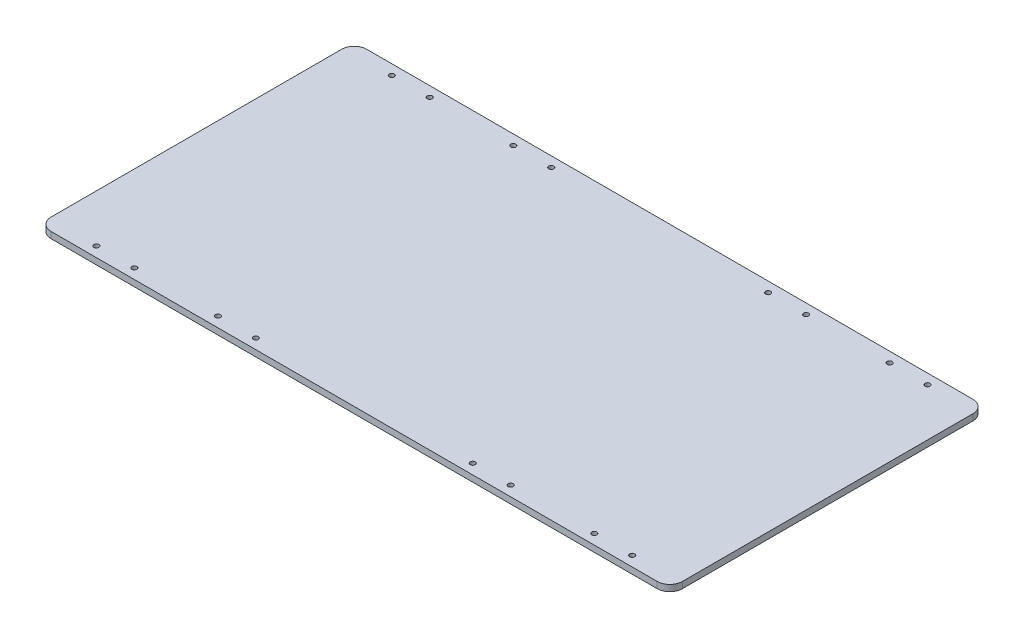
ISO-10303-21;
HEADER;
FILE_DESCRIPTION(('STEP AP214'),'2;1');
FILE_NAME('part.step','',(''),(''),'','','');
FILE_SCHEMA(('AUTOMOTIVE_DESIGN { 1 0 10303 214 1 1 1 1 }'));
ENDSEC;
DATA;
#1=APPLICATION_CONTEXT('core data for automotive mechanical design processes');
#2=APPLICATION_PROTOCOL_DEFINITION('international standard','automotive_design',2000,#1);
#3=PRODUCT_CONTEXT('',#1,'mechanical');
#4=PRODUCT('Part','Part','',(#3));
#5=PRODUCT_RELATED_PRODUCT_CATEGORY('part','',(#4));
#6=PRODUCT_DEFINITION_FORMATION('','',#4);
#7=PRODUCT_DEFINITION_CONTEXT('part definition',#1,'design');
#8=PRODUCT_DEFINITION('design','',#6,#7);
#9=PRODUCT_DEFINITION_SHAPE('','',#8);
#10=(LENGTH_UNIT() NAMED_UNIT(*) SI_UNIT(.MILLI.,.METRE.));
#11=(NAMED_UNIT(*) PLANE_ANGLE_UNIT() SI_UNIT($,.RADIAN.));
#12=(NAMED_UNIT(*) SI_UNIT($,.STERADIAN.) SOLID_ANGLE_UNIT());
#13=UNCERTAINTY_MEASURE_WITH_UNIT(LENGTH_MEASURE(1.E-05),#10,'distance_accuracy_value','');
#14=(GEOMETRIC_REPRESENTATION_CONTEXT(3) GLOBAL_UNCERTAINTY_ASSIGNED_CONTEXT((#13)) GLOBAL_UNIT_ASSIGNED_CONTEXT((#10,
#11,#12)) REPRESENTATION_CONTEXT('',''));
#15=CARTESIAN_POINT('',(0.,0.,0.));
#16=DIRECTION('',(0.,0.,1.));
#17=DIRECTION('',(1.,0.,0.));
#18=AXIS2_PLACEMENT_3D('',#15,#16,#17);
#19=CARTESIAN_POINT('',(240.,5.,-115.));
#20=DIRECTION('',(0.,-1.,0.));
#21=DIRECTION('',(0.,0.,-1.));
#22=AXIS2_PLACEMENT_3D('',#19,#20,#21);
#23=CYLINDRICAL_SURFACE('',#22,10.);
#24=CARTESIAN_POINT('',(240.,0.,-115.));
#25=DIRECTION('',(0.,1.,0.));
#26=DIRECTION('',(0.,0.,1.));
#27=AXIS2_PLACEMENT_3D('',#24,#25,#26);
#28=CIRCLE('',#27,10.);
#29=CARTESIAN_POINT('',(250.,0.,-115.));
#30=VERTEX_POINT('',#29);
#31=CARTESIAN_POINT('',(240.,0.,-125.));
#32=VERTEX_POINT('',#31);
#33=EDGE_CURVE('E147',#30,#32,#28,.T.);
#34=ORIENTED_EDGE('',*,*,#33,.T.);
#35=DIRECTION('',(0.,-1.,0.));
#36=VECTOR('',#35,1.);
#37=CARTESIAN_POINT('',(240.,5.,-125.));
#38=LINE('',#37,#36);
#39=CARTESIAN_POINT('',(240.,5.,-125.));
#40=VERTEX_POINT('',#39);
#41=EDGE_CURVE('E11',#40,#32,#38,.T.);
#42=ORIENTED_EDGE('',*,*,#41,.F.);
#43=CARTESIAN_POINT('',(240.,5.,-115.));
#44=DIRECTION('',(0.,1.,0.));
#45=DIRECTION('',(0.,0.,1.));
#46=AXIS2_PLACEMENT_3D('',#43,#44,#45);
#47=CIRCLE('',#46,10.);
#48=CARTESIAN_POINT('',(250.,5.,-115.));
#49=VERTEX_POINT('',#48);
#50=EDGE_CURVE('E169',#49,#40,#47,.T.);
#51=ORIENTED_EDGE('',*,*,#50,.F.);
#52=DIRECTION('',(0.,-1.,0.));
#53=VECTOR('',#52,1.);
#54=CARTESIAN_POINT('',(250.,5.,-115.));
#55=LINE('',#54,#53);
#56=EDGE_CURVE('E143',#49,#30,#55,.T.);
#57=ORIENTED_EDGE('',*,*,#56,.T.);
#58=EDGE_LOOP('',(#34,#42,#51,#57));
#59=FACE_BOUND('',#58,.T.);
#60=ADVANCED_FACE('F44',(#59),#23,.T.);
#61=CARTESIAN_POINT('',(240.,5.,-125.));
#62=DIRECTION('',(0.,0.,1.));
#63=DIRECTION('',(1.,0.,0.));
#64=AXIS2_PLACEMENT_3D('',#61,#62,#63);
#65=PLANE('',#64);
#66=DIRECTION('',(-1.,0.,0.));
#67=VECTOR('',#66,1.);
#68=CARTESIAN_POINT('',(240.,0.,-125.));
#69=LINE('',#68,#67);
#70=CARTESIAN_POINT('',(-240.,0.,-125.));
#71=VERTEX_POINT('',#70);
#72=EDGE_CURVE('E151',#32,#71,#69,.T.);
#73=ORIENTED_EDGE('',*,*,#72,.T.);
#74=DIRECTION('',(0.,-1.,0.));
#75=VECTOR('',#74,1.);
#76=CARTESIAN_POINT('',(-240.,5.,-125.));
#77=LINE('',#76,#75);
#78=CARTESIAN_POINT('',(-240.,5.,-125.));
#79=VERTEX_POINT('',#78);
#80=EDGE_CURVE('E54',#79,#71,#77,.T.);
#81=ORIENTED_EDGE('',*,*,#80,.F.);
#82=DIRECTION('',(-1.,0.,0.));
#83=VECTOR('',#82,1.);
#84=CARTESIAN_POINT('',(240.,5.,-125.));
#85=LINE('',#84,#83);
#86=EDGE_CURVE('E106',#40,#79,#85,.T.);
#87=ORIENTED_EDGE('',*,*,#86,.F.);
#88=ORIENTED_EDGE('',*,*,#41,.T.);
#89=EDGE_LOOP('',(#73,#81,#87,#88));
#90=FACE_BOUND('',#89,.T.);
#91=ADVANCED_FACE('F268',(#90),#65,.F.);
#92=CARTESIAN_POINT('',(-240.,5.,-115.));
#93=DIRECTION('',(0.,-1.,0.));
#94=DIRECTION('',(0.,0.,-1.));
#95=AXIS2_PLACEMENT_3D('',#92,#93,#94);
#96=CYLINDRICAL_SURFACE('',#95,10.);
#97=CARTESIAN_POINT('',(-240.,0.,-115.));
#98=DIRECTION('',(0.,1.,0.));
#99=DIRECTION('',(0.,0.,1.));
#100=AXIS2_PLACEMENT_3D('',#97,#98,#99);
#101=CIRCLE('',#100,10.);
#102=CARTESIAN_POINT('',(-250.,0.,-115.));
#103=VERTEX_POINT('',#102);
#104=EDGE_CURVE('E154',#71,#103,#101,.T.);
#105=ORIENTED_EDGE('',*,*,#104,.T.);
#106=DIRECTION('',(0.,-1.,0.));
#107=VECTOR('',#106,1.);
#108=CARTESIAN_POINT('',(-250.,5.,-115.));
#109=LINE('',#108,#107);
#110=CARTESIAN_POINT('',(-250.,5.,-115.));
#111=VERTEX_POINT('',#110);
#112=EDGE_CURVE('E180',#111,#103,#109,.T.);
#113=ORIENTED_EDGE('',*,*,#112,.F.);
#114=CARTESIAN_POINT('',(-240.,5.,-115.));
#115=DIRECTION('',(0.,1.,0.));
#116=DIRECTION('',(0.,0.,1.));
#117=AXIS2_PLACEMENT_3D('',#114,#115,#116);
#118=CIRCLE('',#117,10.);
#119=EDGE_CURVE('E283',#79,#111,#118,.T.);
#120=ORIENTED_EDGE('',*,*,#119,.F.);
#121=ORIENTED_EDGE('',*,*,#80,.T.);
#122=EDGE_LOOP('',(#105,#113,#120,#121));
#123=FACE_BOUND('',#122,.T.);
#124=ADVANCED_FACE('F273',(#123),#96,.T.);
#125=CARTESIAN_POINT('',(-250.,5.,115.));
#126=DIRECTION('',(1.,0.,0.));
#127=DIRECTION('',(0.,0.,-1.));
#128=AXIS2_PLACEMENT_3D('',#125,#126,#127);
#129=PLANE('',#128);
#130=DIRECTION('',(0.,0.,1.));
#131=VECTOR('',#130,1.);
#132=CARTESIAN_POINT('',(-250.,0.,115.));
#133=LINE('',#132,#131);
#134=CARTESIAN_POINT('',(-250.,0.,115.));
#135=VERTEX_POINT('',#134);
#136=EDGE_CURVE('E157',#103,#135,#133,.T.);
#137=ORIENTED_EDGE('',*,*,#136,.T.);
#138=DIRECTION('',(0.,-1.,0.));
#139=VECTOR('',#138,1.);
#140=CARTESIAN_POINT('',(-250.,5.,115.));
#141=LINE('',#140,#139);
#142=CARTESIAN_POINT('',(-250.,5.,115.));
#143=VERTEX_POINT('',#142);
#144=EDGE_CURVE('E176',#143,#135,#141,.T.);
#145=ORIENTED_EDGE('',*,*,#144,.F.);
#146=DIRECTION('',(0.,0.,1.));
#147=VECTOR('',#146,1.);
#148=CARTESIAN_POINT('',(-250.,5.,115.));
#149=LINE('',#148,#147);
#150=EDGE_CURVE('E286',#111,#143,#149,.T.);
#151=ORIENTED_EDGE('',*,*,#150,.F.);
#152=ORIENTED_EDGE('',*,*,#112,.T.);
#153=EDGE_LOOP('',(#137,#145,#151,#152));
#154=FACE_BOUND('',#153,.T.);
#155=ADVANCED_FACE('F398',(#154),#129,.F.);
#156=CARTESIAN_POINT('',(-240.,5.,115.));
#157=DIRECTION('',(0.,-1.,0.));
#158=DIRECTION('',(0.,0.,-1.));
#159=AXIS2_PLACEMENT_3D('',#156,#157,#158);
#160=CYLINDRICAL_SURFACE('',#159,10.);
#161=CARTESIAN_POINT('',(-240.,0.,115.));
#162=DIRECTION('',(0.,1.,0.));
#163=DIRECTION('',(0.,0.,-1.));
#164=AXIS2_PLACEMENT_3D('',#161,#162,#163);
#165=CIRCLE('',#164,10.);
#166=CARTESIAN_POINT('',(-240.,0.,125.));
#167=VERTEX_POINT('',#166);
#168=EDGE_CURVE('E160',#135,#167,#165,.T.);
#169=ORIENTED_EDGE('',*,*,#168,.T.);
#170=DIRECTION('',(0.,-1.,0.));
#171=VECTOR('',#170,1.);
#172=CARTESIAN_POINT('',(-240.,5.,125.));
#173=LINE('',#172,#171);
#174=CARTESIAN_POINT('',(-240.,5.,125.));
#175=VERTEX_POINT('',#174);
#176=EDGE_CURVE('E136',#175,#167,#173,.T.);
#177=ORIENTED_EDGE('',*,*,#176,.F.);
#178=CARTESIAN_POINT('',(-240.,5.,115.));
#179=DIRECTION('',(0.,1.,0.));
#180=DIRECTION('',(0.,0.,-1.));
#181=AXIS2_PLACEMENT_3D('',#178,#179,#180);
#182=CIRCLE('',#181,10.);
#183=EDGE_CURVE('E125',#143,#175,#182,.T.);
#184=ORIENTED_EDGE('',*,*,#183,.F.);
#185=ORIENTED_EDGE('',*,*,#144,.T.);
#186=EDGE_LOOP('',(#169,#177,#184,#185));
#187=FACE_BOUND('',#186,.T.);
#188=ADVANCED_FACE('F395',(#187),#160,.T.);
#189=CARTESIAN_POINT('',(240.,5.,125.));
#190=DIRECTION('',(0.,0.,-1.));
#191=DIRECTION('',(-1.,0.,0.));
#192=AXIS2_PLACEMENT_3D('',#189,#190,#191);
#193=PLANE('',#192);
#194=DIRECTION('',(1.,0.,0.));
#195=VECTOR('',#194,1.);
#196=CARTESIAN_POINT('',(240.,0.,125.));
#197=LINE('',#196,#195);
#198=CARTESIAN_POINT('',(240.,0.,125.));
#199=VERTEX_POINT('',#198);
#200=EDGE_CURVE('E134',#167,#199,#197,.T.);
#201=ORIENTED_EDGE('',*,*,#200,.T.);
#202=DIRECTION('',(0.,-1.,0.));
#203=VECTOR('',#202,1.);
#204=CARTESIAN_POINT('',(240.,5.,125.));
#205=LINE('',#204,#203);
#206=CARTESIAN_POINT('',(240.,5.,125.));
#207=VERTEX_POINT('',#206);
#208=EDGE_CURVE('E131',#207,#199,#205,.T.);
#209=ORIENTED_EDGE('',*,*,#208,.F.);
#210=DIRECTION('',(1.,0.,0.));
#211=VECTOR('',#210,1.);
#212=CARTESIAN_POINT('',(240.,5.,125.));
#213=LINE('',#212,#211);
#214=EDGE_CURVE('E119',#175,#207,#213,.T.);
#215=ORIENTED_EDGE('',*,*,#214,.F.);
#216=ORIENTED_EDGE('',*,*,#176,.T.);
#217=EDGE_LOOP('',(#201,#209,#215,#216));
#218=FACE_BOUND('',#217,.T.);
#219=ADVANCED_FACE('F132',(#218),#193,.F.);
#220=CARTESIAN_POINT('',(240.,5.,115.));
#221=DIRECTION('',(0.,-1.,0.));
#222=DIRECTION('',(0.,0.,-1.));
#223=AXIS2_PLACEMENT_3D('',#220,#221,#222);
#224=CYLINDRICAL_SURFACE('',#223,10.);
#225=CARTESIAN_POINT('',(240.,0.,115.));
#226=DIRECTION('',(0.,1.,0.));
#227=DIRECTION('',(0.,0.,1.));
#228=AXIS2_PLACEMENT_3D('',#225,#226,#227);
#229=CIRCLE('',#228,10.);
#230=CARTESIAN_POINT('',(250.,0.,115.));
#231=VERTEX_POINT('',#230);
#232=EDGE_CURVE('E92',#199,#231,#229,.T.);
#233=ORIENTED_EDGE('',*,*,#232,.T.);
#234=DIRECTION('',(0.,-1.,0.));
#235=VECTOR('',#234,1.);
#236=CARTESIAN_POINT('',(250.,5.,115.));
#237=LINE('',#236,#235);
#238=CARTESIAN_POINT('',(250.,5.,115.));
#239=VERTEX_POINT('',#238);
#240=EDGE_CURVE('E137',#239,#231,#237,.T.);
#241=ORIENTED_EDGE('',*,*,#240,.F.);
#242=CARTESIAN_POINT('',(240.,5.,115.));
#243=DIRECTION('',(0.,1.,0.));
#244=DIRECTION('',(0.,0.,1.));
#245=AXIS2_PLACEMENT_3D('',#242,#243,#244);
#246=CIRCLE('',#245,10.);
#247=EDGE_CURVE('E123',#207,#239,#246,.T.);
#248=ORIENTED_EDGE('',*,*,#247,.F.);
#249=ORIENTED_EDGE('',*,*,#208,.T.);
#250=EDGE_LOOP('',(#233,#241,#248,#249));
#251=FACE_BOUND('',#250,.T.);
#252=ADVANCED_FACE('F139',(#251),#224,.T.);
#253=CARTESIAN_POINT('',(250.,5.,115.));
#254=DIRECTION('',(-1.,0.,0.));
#255=DIRECTION('',(0.,0.,1.));
#256=AXIS2_PLACEMENT_3D('',#253,#254,#255);
#257=PLANE('',#256);
#258=DIRECTION('',(0.,0.,-1.));
#259=VECTOR('',#258,1.);
#260=CARTESIAN_POINT('',(250.,0.,115.));
#261=LINE('',#260,#259);
#262=EDGE_CURVE('E98',#231,#30,#261,.T.);
#263=ORIENTED_EDGE('',*,*,#262,.T.);
#264=ORIENTED_EDGE('',*,*,#56,.F.);
#265=DIRECTION('',(0.,0.,-1.));
#266=VECTOR('',#265,1.);
#267=CARTESIAN_POINT('',(250.,5.,115.));
#268=LINE('',#267,#266);
#269=EDGE_CURVE('E63',#239,#49,#268,.T.);
#270=ORIENTED_EDGE('',*,*,#269,.F.);
#271=ORIENTED_EDGE('',*,*,#240,.T.);
#272=EDGE_LOOP('',(#263,#264,#270,#271));
#273=FACE_BOUND('',#272,.T.);
#274=ADVANCED_FACE('F364',(#273),#257,.F.);
#275=CARTESIAN_POINT('',(240.,5.,-115.));
#276=DIRECTION('',(0.,1.,0.));
#277=DIRECTION('',(0.,0.,1.));
#278=AXIS2_PLACEMENT_3D('',#275,#276,#277);
#279=PLANE('',#278);
#280=CARTESIAN_POINT('',(182.15,5.,116.98));
#281=DIRECTION('',(0.,1.,0.));
#282=DIRECTION('',(0.,0.,-1.));
#283=AXIS2_PLACEMENT_3D('',#280,#281,#282);
#284=CIRCLE('',#283,2.);
#285=CARTESIAN_POINT('',(182.15,5.,114.98));
#286=VERTEX_POINT('',#285);
#287=EDGE_CURVE('E305',#286,#286,#284,.T.);
#288=ORIENTED_EDGE('',*,*,#287,.F.);
#289=EDGE_LOOP('',(#288));
#290=FACE_BOUND('',#289,.T.);
#291=CARTESIAN_POINT('',(115.95,5.,116.98));
#292=DIRECTION('',(0.,1.,0.));
#293=DIRECTION('',(0.,0.,-1.));
#294=AXIS2_PLACEMENT_3D('',#291,#292,#293);
#295=CIRCLE('',#294,2.);
#296=CARTESIAN_POINT('',(115.95,5.,114.98));
#297=VERTEX_POINT('',#296);
#298=EDGE_CURVE('E316',#297,#297,#295,.T.);
#299=ORIENTED_EDGE('',*,*,#298,.F.);
#300=EDGE_LOOP('',(#299));
#301=FACE_BOUND('',#300,.T.);
#302=CARTESIAN_POINT('',(85.9000000000002,5.,116.98));
#303=DIRECTION('',(0.,1.,0.));
#304=DIRECTION('',(0.,0.,-1.));
#305=AXIS2_PLACEMENT_3D('',#302,#303,#304);
#306=CIRCLE('',#305,2.);
#307=CARTESIAN_POINT('',(85.9000000000002,5.,114.98));
#308=VERTEX_POINT('',#307);
#309=EDGE_CURVE('E320',#308,#308,#306,.T.);
#310=ORIENTED_EDGE('',*,*,#309,.F.);
#311=EDGE_LOOP('',(#310));
#312=FACE_BOUND('',#311,.T.);
#313=CARTESIAN_POINT('',(212.2,5.,-116.98));
#314=DIRECTION('',(0.,1.,0.));
#315=DIRECTION('',(0.,0.,1.));
#316=AXIS2_PLACEMENT_3D('',#313,#314,#315);
#317=CIRCLE('',#316,2.);
#318=CARTESIAN_POINT('',(212.2,5.,-114.98));
#319=VERTEX_POINT('',#318);
#320=EDGE_CURVE('E323',#319,#319,#317,.T.);
#321=ORIENTED_EDGE('',*,*,#320,.F.);
#322=EDGE_LOOP('',(#321));
#323=FACE_BOUND('',#322,.T.);
#324=CARTESIAN_POINT('',(212.2,5.,116.98));
#325=DIRECTION('',(0.,1.,0.));
#326=DIRECTION('',(0.,0.,-1.));
#327=AXIS2_PLACEMENT_3D('',#324,#325,#326);
#328=CIRCLE('',#327,2.);
#329=CARTESIAN_POINT('',(212.2,5.,114.98));
#330=VERTEX_POINT('',#329);
#331=EDGE_CURVE('E300',#330,#330,#328,.T.);
#332=ORIENTED_EDGE('',*,*,#331,.F.);
#333=EDGE_LOOP('',(#332));
#334=FACE_BOUND('',#333,.T.);
#335=CARTESIAN_POINT('',(-85.9000000000001,5.,116.98));
#336=DIRECTION('',(0.,1.,0.));
#337=DIRECTION('',(0.,0.,1.));
#338=AXIS2_PLACEMENT_3D('',#335,#336,#337);
#339=CIRCLE('',#338,2.);
#340=CARTESIAN_POINT('',(-85.9000000000001,5.,118.98));
#341=VERTEX_POINT('',#340);
#342=EDGE_CURVE('E304',#341,#341,#339,.T.);
#343=ORIENTED_EDGE('',*,*,#342,.F.);
#344=EDGE_LOOP('',(#343));
#345=FACE_BOUND('',#344,.T.);
#346=CARTESIAN_POINT('',(-115.95,5.,116.98));
#347=DIRECTION('',(0.,1.,0.));
#348=DIRECTION('',(0.,0.,1.));
#349=AXIS2_PLACEMENT_3D('',#346,#347,#348);
#350=CIRCLE('',#349,2.);
#351=CARTESIAN_POINT('',(-115.95,5.,118.98));
#352=VERTEX_POINT('',#351);
#353=EDGE_CURVE('E309',#352,#352,#350,.T.);
#354=ORIENTED_EDGE('',*,*,#353,.F.);
#355=EDGE_LOOP('',(#354));
#356=FACE_BOUND('',#355,.T.);
#357=CARTESIAN_POINT('',(-182.15,5.,116.98));
#358=DIRECTION('',(0.,1.,0.));
#359=DIRECTION('',(0.,0.,1.));
#360=AXIS2_PLACEMENT_3D('',#357,#358,#359);
#361=CIRCLE('',#360,2.);
#362=CARTESIAN_POINT('',(-182.15,5.,118.98));
#363=VERTEX_POINT('',#362);
#364=EDGE_CURVE('E299',#363,#363,#361,.T.);
#365=ORIENTED_EDGE('',*,*,#364,.F.);
#366=EDGE_LOOP('',(#365));
#367=FACE_BOUND('',#366,.T.);
#368=CARTESIAN_POINT('',(-212.2,5.,-116.98));
#369=DIRECTION('',(0.,1.,0.));
#370=DIRECTION('',(0.,0.,-1.));
#371=AXIS2_PLACEMENT_3D('',#368,#369,#370);
#372=CIRCLE('',#371,2.);
#373=CARTESIAN_POINT('',(-212.2,5.,-118.98));
#374=VERTEX_POINT('',#373);
#375=EDGE_CURVE('E336',#374,#374,#372,.T.);
#376=ORIENTED_EDGE('',*,*,#375,.F.);
#377=EDGE_LOOP('',(#376));
#378=FACE_BOUND('',#377,.T.);
#379=CARTESIAN_POINT('',(-85.9000000000001,5.,-116.98));
#380=DIRECTION('',(0.,1.,0.));
#381=DIRECTION('',(0.,0.,-1.));
#382=AXIS2_PLACEMENT_3D('',#379,#380,#381);
#383=CIRCLE('',#382,2.);
#384=CARTESIAN_POINT('',(-85.9000000000001,5.,-118.98));
#385=VERTEX_POINT('',#384);
#386=EDGE_CURVE('E347',#385,#385,#383,.T.);
#387=ORIENTED_EDGE('',*,*,#386,.F.);
#388=EDGE_LOOP('',(#387));
#389=FACE_BOUND('',#388,.T.);
#390=CARTESIAN_POINT('',(-115.95,5.,-116.98));
#391=DIRECTION('',(0.,1.,0.));
#392=DIRECTION('',(0.,0.,-1.));
#393=AXIS2_PLACEMENT_3D('',#390,#391,#392);
#394=CIRCLE('',#393,2.);
#395=CARTESIAN_POINT('',(-115.95,5.,-118.98));
#396=VERTEX_POINT('',#395);
#397=EDGE_CURVE('E351',#396,#396,#394,.T.);
#398=ORIENTED_EDGE('',*,*,#397,.F.);
#399=EDGE_LOOP('',(#398));
#400=FACE_BOUND('',#399,.T.);
#401=CARTESIAN_POINT('',(-182.15,5.,-116.98));
#402=DIRECTION('',(0.,1.,0.));
#403=DIRECTION('',(0.,0.,-1.));
#404=AXIS2_PLACEMENT_3D('',#401,#402,#403);
#405=CIRCLE('',#404,2.);
#406=CARTESIAN_POINT('',(-182.15,5.,-118.98));
#407=VERTEX_POINT('',#406);
#408=EDGE_CURVE('E331',#407,#407,#405,.T.);
#409=ORIENTED_EDGE('',*,*,#408,.F.);
#410=EDGE_LOOP('',(#409));
#411=FACE_BOUND('',#410,.T.);
#412=CARTESIAN_POINT('',(85.9000000000002,5.,-116.98));
#413=DIRECTION('',(0.,1.,0.));
#414=DIRECTION('',(0.,0.,1.));
#415=AXIS2_PLACEMENT_3D('',#412,#413,#414);
#416=CIRCLE('',#415,2.);
#417=CARTESIAN_POINT('',(85.9000000000002,5.,-114.98));
#418=VERTEX_POINT('',#417);
#419=EDGE_CURVE('E335',#418,#418,#416,.T.);
#420=ORIENTED_EDGE('',*,*,#419,.F.);
#421=EDGE_LOOP('',(#420));
#422=FACE_BOUND('',#421,.T.);
#423=CARTESIAN_POINT('',(115.95,5.,-116.98));
#424=DIRECTION('',(0.,1.,0.));
#425=DIRECTION('',(0.,0.,1.));
#426=AXIS2_PLACEMENT_3D('',#423,#424,#425);
#427=CIRCLE('',#426,2.);
#428=CARTESIAN_POINT('',(115.95,5.,-114.98));
#429=VERTEX_POINT('',#428);
#430=EDGE_CURVE('E340',#429,#429,#427,.T.);
#431=ORIENTED_EDGE('',*,*,#430,.F.);
#432=EDGE_LOOP('',(#431));
#433=FACE_BOUND('',#432,.T.);
#434=CARTESIAN_POINT('',(182.15,5.,-116.98));
#435=DIRECTION('',(0.,1.,0.));
#436=DIRECTION('',(0.,0.,1.));
#437=AXIS2_PLACEMENT_3D('',#434,#435,#436);
#438=CIRCLE('',#437,2.);
#439=CARTESIAN_POINT('',(182.15,5.,-114.98));
#440=VERTEX_POINT('',#439);
#441=EDGE_CURVE('E327',#440,#440,#438,.T.);
#442=ORIENTED_EDGE('',*,*,#441,.F.);
#443=EDGE_LOOP('',(#442));
#444=FACE_BOUND('',#443,.T.);
#445=CARTESIAN_POINT('',(-212.2,5.,116.98));
#446=DIRECTION('',(0.,1.,0.));
#447=DIRECTION('',(0.,0.,1.));
#448=AXIS2_PLACEMENT_3D('',#445,#446,#447);
#449=CIRCLE('',#448,2.);
#450=CARTESIAN_POINT('',(-212.2,5.,118.98));
#451=VERTEX_POINT('',#450);
#452=EDGE_CURVE('E192',#451,#451,#449,.T.);
#453=ORIENTED_EDGE('',*,*,#452,.F.);
#454=EDGE_LOOP('',(#453));
#455=FACE_BOUND('',#454,.T.);
#456=ORIENTED_EDGE('',*,*,#50,.T.);
#457=ORIENTED_EDGE('',*,*,#86,.T.);
#458=ORIENTED_EDGE('',*,*,#119,.T.);
#459=ORIENTED_EDGE('',*,*,#150,.T.);
#460=ORIENTED_EDGE('',*,*,#183,.T.);
#461=ORIENTED_EDGE('',*,*,#214,.T.);
#462=ORIENTED_EDGE('',*,*,#247,.T.);
#463=ORIENTED_EDGE('',*,*,#269,.T.);
#464=EDGE_LOOP('',(#456,#457,#458,#459,#460,#461,#462,#463));
#465=FACE_BOUND('',#464,.T.);
#466=ADVANCED_FACE('F121',(#290,#301,#312,#323,#334,#345,#356,#367,#378,#389,#400,#411,#422,
#433,#444,#455,#465),#279,.T.);
#467=CARTESIAN_POINT('',(240.,0.,-115.));
#468=DIRECTION('',(0.,1.,0.));
#469=DIRECTION('',(0.,0.,1.));
#470=AXIS2_PLACEMENT_3D('',#467,#468,#469);
#471=PLANE('',#470);
#472=CARTESIAN_POINT('',(182.15,0.,116.98));
#473=DIRECTION('',(0.,1.,0.));
#474=DIRECTION('',(0.,0.,1.));
#475=AXIS2_PLACEMENT_3D('',#472,#473,#474);
#476=CIRCLE('',#475,2.);
#477=CARTESIAN_POINT('',(182.15,0.,118.98));
#478=VERTEX_POINT('',#477);
#479=EDGE_CURVE('E47',#478,#478,#476,.T.);
#480=ORIENTED_EDGE('',*,*,#479,.T.);
#481=EDGE_LOOP('',(#480));
#482=FACE_BOUND('',#481,.T.);
#483=CARTESIAN_POINT('',(115.95,0.,116.98));
#484=DIRECTION('',(0.,1.,0.));
#485=DIRECTION('',(0.,0.,1.));
#486=AXIS2_PLACEMENT_3D('',#483,#484,#485);
#487=CIRCLE('',#486,2.);
#488=CARTESIAN_POINT('',(115.95,0.,118.98));
#489=VERTEX_POINT('',#488);
#490=EDGE_CURVE('E243',#489,#489,#487,.T.);
#491=ORIENTED_EDGE('',*,*,#490,.T.);
#492=EDGE_LOOP('',(#491));
#493=FACE_BOUND('',#492,.T.);
#494=CARTESIAN_POINT('',(85.9000000000002,0.,116.98));
#495=DIRECTION('',(0.,1.,0.));
#496=DIRECTION('',(0.,0.,1.));
#497=AXIS2_PLACEMENT_3D('',#494,#495,#496);
#498=CIRCLE('',#497,2.);
#499=CARTESIAN_POINT('',(85.9000000000002,0.,118.98));
#500=VERTEX_POINT('',#499);
#501=EDGE_CURVE('E240',#500,#500,#498,.T.);
#502=ORIENTED_EDGE('',*,*,#501,.T.);
#503=EDGE_LOOP('',(#502));
#504=FACE_BOUND('',#503,.T.);
#505=CARTESIAN_POINT('',(212.2,0.,-116.98));
#506=DIRECTION('',(0.,1.,0.));
#507=DIRECTION('',(0.,0.,1.));
#508=AXIS2_PLACEMENT_3D('',#505,#506,#507);
#509=CIRCLE('',#508,2.);
#510=CARTESIAN_POINT('',(212.2,0.,-114.98));
#511=VERTEX_POINT('',#510);
#512=EDGE_CURVE('E236',#511,#511,#509,.T.);
#513=ORIENTED_EDGE('',*,*,#512,.T.);
#514=EDGE_LOOP('',(#513));
#515=FACE_BOUND('',#514,.T.);
#516=CARTESIAN_POINT('',(212.2,0.,116.98));
#517=DIRECTION('',(0.,1.,0.));
#518=DIRECTION('',(0.,0.,1.));
#519=AXIS2_PLACEMENT_3D('',#516,#517,#518);
#520=CIRCLE('',#519,2.);
#521=CARTESIAN_POINT('',(212.2,0.,118.98));
#522=VERTEX_POINT('',#521);
#523=EDGE_CURVE('E232',#522,#522,#520,.T.);
#524=ORIENTED_EDGE('',*,*,#523,.T.);
#525=EDGE_LOOP('',(#524));
#526=FACE_BOUND('',#525,.T.);
#527=CARTESIAN_POINT('',(-85.9000000000001,0.,116.98));
#528=DIRECTION('',(0.,1.,0.));
#529=DIRECTION('',(0.,0.,1.));
#530=AXIS2_PLACEMENT_3D('',#527,#528,#529);
#531=CIRCLE('',#530,2.);
#532=CARTESIAN_POINT('',(-85.9000000000001,0.,118.98));
#533=VERTEX_POINT('',#532);
#534=EDGE_CURVE('E228',#533,#533,#531,.T.);
#535=ORIENTED_EDGE('',*,*,#534,.T.);
#536=EDGE_LOOP('',(#535));
#537=FACE_BOUND('',#536,.T.);
#538=CARTESIAN_POINT('',(-115.95,0.,116.98));
#539=DIRECTION('',(0.,1.,0.));
#540=DIRECTION('',(0.,0.,1.));
#541=AXIS2_PLACEMENT_3D('',#538,#539,#540);
#542=CIRCLE('',#541,2.);
#543=CARTESIAN_POINT('',(-115.95,0.,118.98));
#544=VERTEX_POINT('',#543);
#545=EDGE_CURVE('E224',#544,#544,#542,.T.);
#546=ORIENTED_EDGE('',*,*,#545,.T.);
#547=EDGE_LOOP('',(#546));
#548=FACE_BOUND('',#547,.T.);
#549=CARTESIAN_POINT('',(-182.15,0.,116.98));
#550=DIRECTION('',(0.,1.,0.));
#551=DIRECTION('',(0.,0.,1.));
#552=AXIS2_PLACEMENT_3D('',#549,#550,#551);
#553=CIRCLE('',#552,2.);
#554=CARTESIAN_POINT('',(-182.15,0.,118.98));
#555=VERTEX_POINT('',#554);
#556=EDGE_CURVE('E220',#555,#555,#553,.T.);
#557=ORIENTED_EDGE('',*,*,#556,.T.);
#558=EDGE_LOOP('',(#557));
#559=FACE_BOUND('',#558,.T.);
#560=CARTESIAN_POINT('',(-212.2,0.,-116.98));
#561=DIRECTION('',(0.,1.,0.));
#562=DIRECTION('',(0.,0.,1.));
#563=AXIS2_PLACEMENT_3D('',#560,#561,#562);
#564=CIRCLE('',#563,2.);
#565=CARTESIAN_POINT('',(-212.2,0.,-114.98));
#566=VERTEX_POINT('',#565);
#567=EDGE_CURVE('E216',#566,#566,#564,.T.);
#568=ORIENTED_EDGE('',*,*,#567,.T.);
#569=EDGE_LOOP('',(#568));
#570=FACE_BOUND('',#569,.T.);
#571=CARTESIAN_POINT('',(-85.9000000000001,0.,-116.98));
#572=DIRECTION('',(0.,1.,0.));
#573=DIRECTION('',(0.,0.,1.));
#574=AXIS2_PLACEMENT_3D('',#571,#572,#573);
#575=CIRCLE('',#574,2.);
#576=CARTESIAN_POINT('',(-85.9000000000001,0.,-114.98));
#577=VERTEX_POINT('',#576);
#578=EDGE_CURVE('E212',#577,#577,#575,.T.);
#579=ORIENTED_EDGE('',*,*,#578,.T.);
#580=EDGE_LOOP('',(#579));
#581=FACE_BOUND('',#580,.T.);
#582=CARTESIAN_POINT('',(-115.95,0.,-116.98));
#583=DIRECTION('',(0.,1.,0.));
#584=DIRECTION('',(0.,0.,1.));
#585=AXIS2_PLACEMENT_3D('',#582,#583,#584);
#586=CIRCLE('',#585,2.);
#587=CARTESIAN_POINT('',(-115.95,0.,-114.98));
#588=VERTEX_POINT('',#587);
#589=EDGE_CURVE('E208',#588,#588,#586,.T.);
#590=ORIENTED_EDGE('',*,*,#589,.T.);
#591=EDGE_LOOP('',(#590));
#592=FACE_BOUND('',#591,.T.);
#593=CARTESIAN_POINT('',(-182.15,0.,-116.98));
#594=DIRECTION('',(0.,1.,0.));
#595=DIRECTION('',(0.,0.,1.));
#596=AXIS2_PLACEMENT_3D('',#593,#594,#595);
#597=CIRCLE('',#596,2.);
#598=CARTESIAN_POINT('',(-182.15,0.,-114.98));
#599=VERTEX_POINT('',#598);
#600=EDGE_CURVE('E204',#599,#599,#597,.T.);
#601=ORIENTED_EDGE('',*,*,#600,.T.);
#602=EDGE_LOOP('',(#601));
#603=FACE_BOUND('',#602,.T.);
#604=CARTESIAN_POINT('',(85.9000000000002,0.,-116.98));
#605=DIRECTION('',(0.,1.,0.));
#606=DIRECTION('',(0.,0.,1.));
#607=AXIS2_PLACEMENT_3D('',#604,#605,#606);
#608=CIRCLE('',#607,2.);
#609=CARTESIAN_POINT('',(85.9000000000002,0.,-114.98));
#610=VERTEX_POINT('',#609);
#611=EDGE_CURVE('E200',#610,#610,#608,.T.);
#612=ORIENTED_EDGE('',*,*,#611,.T.);
#613=EDGE_LOOP('',(#612));
#614=FACE_BOUND('',#613,.T.);
#615=CARTESIAN_POINT('',(115.95,0.,-116.98));
#616=DIRECTION('',(0.,1.,0.));
#617=DIRECTION('',(0.,0.,1.));
#618=AXIS2_PLACEMENT_3D('',#615,#616,#617);
#619=CIRCLE('',#618,2.);
#620=CARTESIAN_POINT('',(115.95,0.,-114.98));
#621=VERTEX_POINT('',#620);
#622=EDGE_CURVE('E196',#621,#621,#619,.T.);
#623=ORIENTED_EDGE('',*,*,#622,.T.);
#624=EDGE_LOOP('',(#623));
#625=FACE_BOUND('',#624,.T.);
#626=CARTESIAN_POINT('',(182.15,0.,-116.98));
#627=DIRECTION('',(0.,1.,0.));
#628=DIRECTION('',(0.,0.,1.));
#629=AXIS2_PLACEMENT_3D('',#626,#627,#628);
#630=CIRCLE('',#629,2.);
#631=CARTESIAN_POINT('',(182.15,0.,-114.98));
#632=VERTEX_POINT('',#631);
#633=EDGE_CURVE('E191',#632,#632,#630,.T.);
#634=ORIENTED_EDGE('',*,*,#633,.T.);
#635=EDGE_LOOP('',(#634));
#636=FACE_BOUND('',#635,.T.);
#637=CARTESIAN_POINT('',(-212.2,0.,116.98));
#638=DIRECTION('',(0.,1.,0.));
#639=DIRECTION('',(0.,0.,1.));
#640=AXIS2_PLACEMENT_3D('',#637,#638,#639);
#641=CIRCLE('',#640,2.);
#642=CARTESIAN_POINT('',(-212.2,0.,118.98));
#643=VERTEX_POINT('',#642);
#644=EDGE_CURVE('E187',#643,#643,#641,.T.);
#645=ORIENTED_EDGE('',*,*,#644,.T.);
#646=EDGE_LOOP('',(#645));
#647=FACE_BOUND('',#646,.T.);
#648=ORIENTED_EDGE('',*,*,#33,.F.);
#649=ORIENTED_EDGE('',*,*,#262,.F.);
#650=ORIENTED_EDGE('',*,*,#232,.F.);
#651=ORIENTED_EDGE('',*,*,#200,.F.);
#652=ORIENTED_EDGE('',*,*,#168,.F.);
#653=ORIENTED_EDGE('',*,*,#136,.F.);
#654=ORIENTED_EDGE('',*,*,#104,.F.);
#655=ORIENTED_EDGE('',*,*,#72,.F.);
#656=EDGE_LOOP('',(#648,#649,#650,#651,#652,#653,#654,#655));
#657=FACE_BOUND('',#656,.T.);
#658=ADVANCED_FACE('F252',(#482,#493,#504,#515,#526,#537,#548,#559,#570,#581,#592,#603,#614,
#625,#636,#647,#657),#471,.F.);
#659=CARTESIAN_POINT('',(-212.2,-5.,116.98));
#660=DIRECTION('',(0.,1.,0.));
#661=DIRECTION('',(0.,0.,1.));
#662=AXIS2_PLACEMENT_3D('',#659,#660,#661);
#663=CYLINDRICAL_SURFACE('',#662,2.);
#664=ORIENTED_EDGE('',*,*,#452,.T.);
#665=EDGE_LOOP('',(#664));
#666=FACE_BOUND('',#665,.T.);
#667=ORIENTED_EDGE('',*,*,#644,.F.);
#668=EDGE_LOOP('',(#667));
#669=FACE_BOUND('',#668,.T.);
#670=ADVANCED_FACE('F377',(#666,#669),#663,.F.);
#671=CARTESIAN_POINT('',(182.15,-5.,-116.98));
#672=DIRECTION('',(0.,1.,0.));
#673=DIRECTION('',(0.,0.,1.));
#674=AXIS2_PLACEMENT_3D('',#671,#672,#673);
#675=CYLINDRICAL_SURFACE('',#674,2.);
#676=ORIENTED_EDGE('',*,*,#441,.T.);
#677=EDGE_LOOP('',(#676));
#678=FACE_BOUND('',#677,.T.);
#679=ORIENTED_EDGE('',*,*,#633,.F.);
#680=EDGE_LOOP('',(#679));
#681=FACE_BOUND('',#680,.T.);
#682=ADVANCED_FACE('F380',(#678,#681),#675,.F.);
#683=CARTESIAN_POINT('',(115.95,-5.,-116.98));
#684=DIRECTION('',(0.,1.,0.));
#685=DIRECTION('',(0.,0.,1.));
#686=AXIS2_PLACEMENT_3D('',#683,#684,#685);
#687=CYLINDRICAL_SURFACE('',#686,2.);
#688=ORIENTED_EDGE('',*,*,#430,.T.);
#689=EDGE_LOOP('',(#688));
#690=FACE_BOUND('',#689,.T.);
#691=ORIENTED_EDGE('',*,*,#622,.F.);
#692=EDGE_LOOP('',(#691));
#693=FACE_BOUND('',#692,.T.);
#694=ADVANCED_FACE('F458',(#690,#693),#687,.F.);
#695=CARTESIAN_POINT('',(85.9000000000002,-5.,-116.98));
#696=DIRECTION('',(0.,1.,0.));
#697=DIRECTION('',(0.,0.,1.));
#698=AXIS2_PLACEMENT_3D('',#695,#696,#697);
#699=CYLINDRICAL_SURFACE('',#698,2.);
#700=ORIENTED_EDGE('',*,*,#419,.T.);
#701=EDGE_LOOP('',(#700));
#702=FACE_BOUND('',#701,.T.);
#703=ORIENTED_EDGE('',*,*,#611,.F.);
#704=EDGE_LOOP('',(#703));
#705=FACE_BOUND('',#704,.T.);
#706=ADVANCED_FACE('F468',(#702,#705),#699,.F.);
#707=CARTESIAN_POINT('',(-182.15,-5.,-116.98));
#708=DIRECTION('',(0.,1.,0.));
#709=DIRECTION('',(0.,0.,1.));
#710=AXIS2_PLACEMENT_3D('',#707,#708,#709);
#711=CYLINDRICAL_SURFACE('',#710,2.);
#712=ORIENTED_EDGE('',*,*,#408,.T.);
#713=EDGE_LOOP('',(#712));
#714=FACE_BOUND('',#713,.T.);
#715=ORIENTED_EDGE('',*,*,#600,.F.);
#716=EDGE_LOOP('',(#715));
#717=FACE_BOUND('',#716,.T.);
#718=ADVANCED_FACE('F478',(#714,#717),#711,.F.);
#719=CARTESIAN_POINT('',(-115.95,-5.,-116.98));
#720=DIRECTION('',(0.,1.,0.));
#721=DIRECTION('',(0.,0.,1.));
#722=AXIS2_PLACEMENT_3D('',#719,#720,#721);
#723=CYLINDRICAL_SURFACE('',#722,2.);
#724=ORIENTED_EDGE('',*,*,#397,.T.);
#725=EDGE_LOOP('',(#724));
#726=FACE_BOUND('',#725,.T.);
#727=ORIENTED_EDGE('',*,*,#589,.F.);
#728=EDGE_LOOP('',(#727));
#729=FACE_BOUND('',#728,.T.);
#730=ADVANCED_FACE('F359',(#726,#729),#723,.F.);
#731=CARTESIAN_POINT('',(-85.9000000000001,-5.,-116.98));
#732=DIRECTION('',(0.,1.,0.));
#733=DIRECTION('',(0.,0.,1.));
#734=AXIS2_PLACEMENT_3D('',#731,#732,#733);
#735=CYLINDRICAL_SURFACE('',#734,2.);
#736=ORIENTED_EDGE('',*,*,#386,.T.);
#737=EDGE_LOOP('',(#736));
#738=FACE_BOUND('',#737,.T.);
#739=ORIENTED_EDGE('',*,*,#578,.F.);
#740=EDGE_LOOP('',(#739));
#741=FACE_BOUND('',#740,.T.);
#742=ADVANCED_FACE('F497',(#738,#741),#735,.F.);
#743=CARTESIAN_POINT('',(-212.2,-5.,-116.98));
#744=DIRECTION('',(0.,1.,0.));
#745=DIRECTION('',(0.,0.,1.));
#746=AXIS2_PLACEMENT_3D('',#743,#744,#745);
#747=CYLINDRICAL_SURFACE('',#746,2.);
#748=ORIENTED_EDGE('',*,*,#375,.T.);
#749=EDGE_LOOP('',(#748));
#750=FACE_BOUND('',#749,.T.);
#751=ORIENTED_EDGE('',*,*,#567,.F.);
#752=EDGE_LOOP('',(#751));
#753=FACE_BOUND('',#752,.T.);
#754=ADVANCED_FACE('F506',(#750,#753),#747,.F.);
#755=CARTESIAN_POINT('',(-182.15,-5.,116.98));
#756=DIRECTION('',(0.,1.,0.));
#757=DIRECTION('',(0.,0.,1.));
#758=AXIS2_PLACEMENT_3D('',#755,#756,#757);
#759=CYLINDRICAL_SURFACE('',#758,2.);
#760=ORIENTED_EDGE('',*,*,#364,.T.);
#761=EDGE_LOOP('',(#760));
#762=FACE_BOUND('',#761,.T.);
#763=ORIENTED_EDGE('',*,*,#556,.F.);
#764=EDGE_LOOP('',(#763));
#765=FACE_BOUND('',#764,.T.);
#766=ADVANCED_FACE('F516',(#762,#765),#759,.F.);
#767=CARTESIAN_POINT('',(-115.95,-5.,116.98));
#768=DIRECTION('',(0.,1.,0.));
#769=DIRECTION('',(0.,0.,1.));
#770=AXIS2_PLACEMENT_3D('',#767,#768,#769);
#771=CYLINDRICAL_SURFACE('',#770,2.);
#772=ORIENTED_EDGE('',*,*,#353,.T.);
#773=EDGE_LOOP('',(#772));
#774=FACE_BOUND('',#773,.T.);
#775=ORIENTED_EDGE('',*,*,#545,.F.);
#776=EDGE_LOOP('',(#775));
#777=FACE_BOUND('',#776,.T.);
#778=ADVANCED_FACE('F526',(#774,#777),#771,.F.);
#779=CARTESIAN_POINT('',(-85.9000000000001,-5.,116.98));
#780=DIRECTION('',(0.,1.,0.));
#781=DIRECTION('',(0.,0.,1.));
#782=AXIS2_PLACEMENT_3D('',#779,#780,#781);
#783=CYLINDRICAL_SURFACE('',#782,2.);
#784=ORIENTED_EDGE('',*,*,#342,.T.);
#785=EDGE_LOOP('',(#784));
#786=FACE_BOUND('',#785,.T.);
#787=ORIENTED_EDGE('',*,*,#534,.F.);
#788=EDGE_LOOP('',(#787));
#789=FACE_BOUND('',#788,.T.);
#790=ADVANCED_FACE('F536',(#786,#789),#783,.F.);
#791=CARTESIAN_POINT('',(212.2,-5.,116.98));
#792=DIRECTION('',(0.,1.,0.));
#793=DIRECTION('',(0.,0.,1.));
#794=AXIS2_PLACEMENT_3D('',#791,#792,#793);
#795=CYLINDRICAL_SURFACE('',#794,2.);
#796=ORIENTED_EDGE('',*,*,#331,.T.);
#797=EDGE_LOOP('',(#796));
#798=FACE_BOUND('',#797,.T.);
#799=ORIENTED_EDGE('',*,*,#523,.F.);
#800=EDGE_LOOP('',(#799));
#801=FACE_BOUND('',#800,.T.);
#802=ADVANCED_FACE('F546',(#798,#801),#795,.F.);
#803=CARTESIAN_POINT('',(212.2,-5.,-116.98));
#804=DIRECTION('',(0.,1.,0.));
#805=DIRECTION('',(0.,0.,1.));
#806=AXIS2_PLACEMENT_3D('',#803,#804,#805);
#807=CYLINDRICAL_SURFACE('',#806,2.);
#808=ORIENTED_EDGE('',*,*,#320,.T.);
#809=EDGE_LOOP('',(#808));
#810=FACE_BOUND('',#809,.T.);
#811=ORIENTED_EDGE('',*,*,#512,.F.);
#812=EDGE_LOOP('',(#811));
#813=FACE_BOUND('',#812,.T.);
#814=ADVANCED_FACE('F556',(#810,#813),#807,.F.);
#815=CARTESIAN_POINT('',(85.9000000000002,-5.,116.98));
#816=DIRECTION('',(0.,1.,0.));
#817=DIRECTION('',(0.,0.,1.));
#818=AXIS2_PLACEMENT_3D('',#815,#816,#817);
#819=CYLINDRICAL_SURFACE('',#818,2.);
#820=ORIENTED_EDGE('',*,*,#309,.T.);
#821=EDGE_LOOP('',(#820));
#822=FACE_BOUND('',#821,.T.);
#823=ORIENTED_EDGE('',*,*,#501,.F.);
#824=EDGE_LOOP('',(#823));
#825=FACE_BOUND('',#824,.T.);
#826=ADVANCED_FACE('F262',(#822,#825),#819,.F.);
#827=CARTESIAN_POINT('',(115.95,-5.,116.98));
#828=DIRECTION('',(0.,1.,0.));
#829=DIRECTION('',(0.,0.,1.));
#830=AXIS2_PLACEMENT_3D('',#827,#828,#829);
#831=CYLINDRICAL_SURFACE('',#830,2.);
#832=ORIENTED_EDGE('',*,*,#298,.T.);
#833=EDGE_LOOP('',(#832));
#834=FACE_BOUND('',#833,.T.);
#835=ORIENTED_EDGE('',*,*,#490,.F.);
#836=EDGE_LOOP('',(#835));
#837=FACE_BOUND('',#836,.T.);
#838=ADVANCED_FACE('F256',(#834,#837),#831,.F.);
#839=CARTESIAN_POINT('',(182.15,-5.,116.98));
#840=DIRECTION('',(0.,1.,0.));
#841=DIRECTION('',(0.,0.,1.));
#842=AXIS2_PLACEMENT_3D('',#839,#840,#841);
#843=CYLINDRICAL_SURFACE('',#842,2.);
#844=ORIENTED_EDGE('',*,*,#287,.T.);
#845=EDGE_LOOP('',(#844));
#846=FACE_BOUND('',#845,.T.);
#847=ORIENTED_EDGE('',*,*,#479,.F.);
#848=EDGE_LOOP('',(#847));
#849=FACE_BOUND('',#848,.T.);
#850=ADVANCED_FACE('F254',(#846,#849),#843,.F.);
#851=CLOSED_SHELL('',(#60,#91,#124,#155,#188,#219,#252,#274,#466,#658,#670,#682,#694,#706,#718,
#730,#742,#754,#766,#778,#790,#802,#814,#826,#838,#850));
#852=MANIFOLD_SOLID_BREP('B2',#851);
#853=ADVANCED_BREP_SHAPE_REPRESENTATION('',(#18,#852),#14);
#854=SHAPE_DEFINITION_REPRESENTATION(#9,#853);
ENDSEC;
END-ISO-10303-21;
